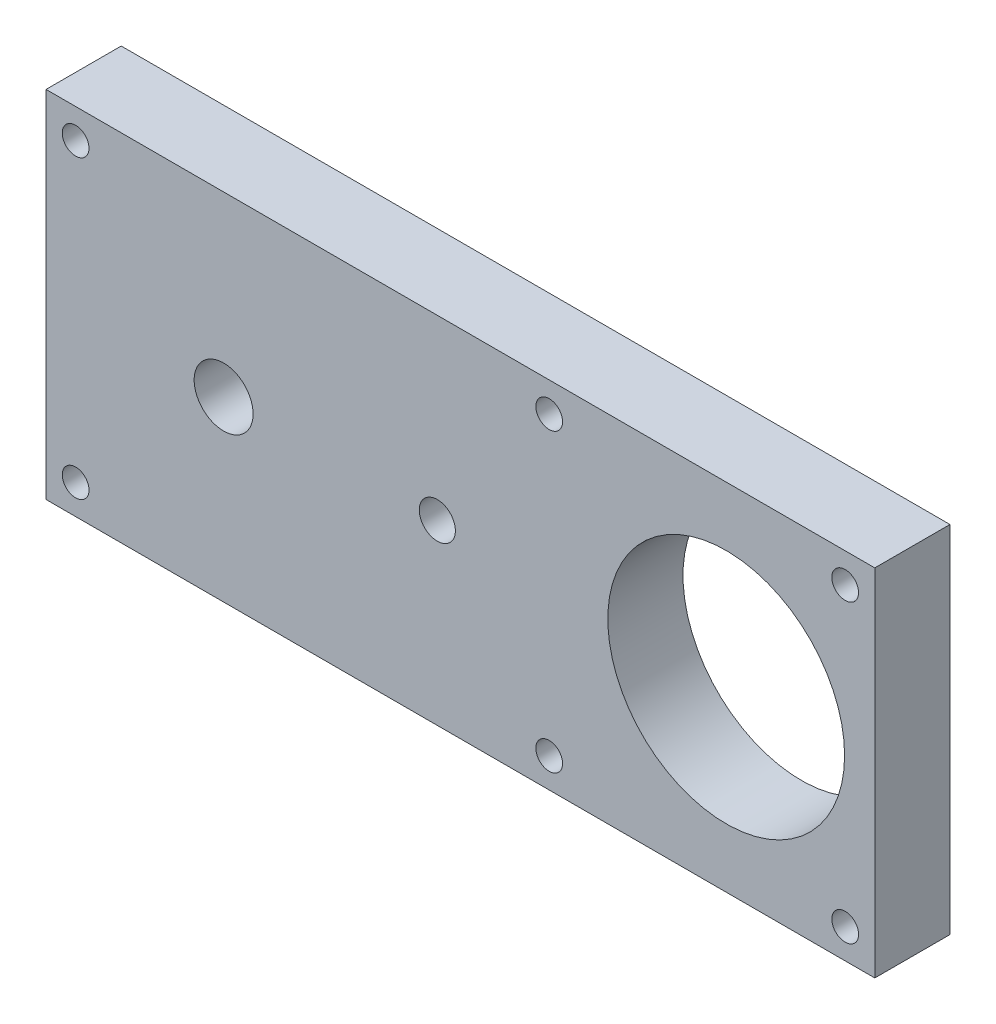
ISO-10303-21;
HEADER;
FILE_DESCRIPTION(('STEP AP214'),'2;1');
FILE_NAME('part.step','',(''),(''),'','','');
FILE_SCHEMA(('AUTOMOTIVE_DESIGN { 1 0 10303 214 1 1 1 1 }'));
ENDSEC;
DATA;
#1=APPLICATION_CONTEXT('core data for automotive mechanical design processes');
#2=APPLICATION_PROTOCOL_DEFINITION('international standard','automotive_design',2000,#1);
#3=PRODUCT_CONTEXT('',#1,'mechanical');
#4=PRODUCT('Part','Part','',(#3));
#5=PRODUCT_RELATED_PRODUCT_CATEGORY('part','',(#4));
#6=PRODUCT_DEFINITION_FORMATION('','',#4);
#7=PRODUCT_DEFINITION_CONTEXT('part definition',#1,'design');
#8=PRODUCT_DEFINITION('design','',#6,#7);
#9=PRODUCT_DEFINITION_SHAPE('','',#8);
#10=(LENGTH_UNIT() NAMED_UNIT(*) SI_UNIT(.MILLI.,.METRE.));
#11=(NAMED_UNIT(*) PLANE_ANGLE_UNIT() SI_UNIT($,.RADIAN.));
#12=(NAMED_UNIT(*) SI_UNIT($,.STERADIAN.) SOLID_ANGLE_UNIT());
#13=UNCERTAINTY_MEASURE_WITH_UNIT(LENGTH_MEASURE(1.E-05),#10,'distance_accuracy_value','');
#14=(GEOMETRIC_REPRESENTATION_CONTEXT(3) GLOBAL_UNCERTAINTY_ASSIGNED_CONTEXT((#13)) GLOBAL_UNIT_ASSIGNED_CONTEXT((#10,
#11,#12)) REPRESENTATION_CONTEXT('',''));
#15=CARTESIAN_POINT('',(0.,0.,0.));
#16=DIRECTION('',(0.,0.,1.));
#17=DIRECTION('',(1.,0.,0.));
#18=AXIS2_PLACEMENT_3D('',#15,#16,#17);
#19=CARTESIAN_POINT('',(0.,0.,0.));
#20=DIRECTION('',(0.,0.,-1.));
#21=DIRECTION('',(-1.,0.,0.));
#22=AXIS2_PLACEMENT_3D('',#19,#20,#21);
#23=PLANE('',#22);
#24=CARTESIAN_POINT('',(33.05,15.,0.));
#25=DIRECTION('',(0.,0.,1.));
#26=DIRECTION('',(1.,0.,0.));
#27=AXIS2_PLACEMENT_3D('',#24,#25,#26);
#28=CIRCLE('',#27,1.52500000000003);
#29=CARTESIAN_POINT('',(34.5750000000001,15.,0.));
#30=VERTEX_POINT('',#29);
#31=EDGE_CURVE('E157',#30,#30,#28,.T.);
#32=ORIENTED_EDGE('',*,*,#31,.T.);
#33=EDGE_LOOP('',(#32));
#34=FACE_BOUND('',#33,.T.);
#35=CARTESIAN_POINT('',(15.,15.,0.));
#36=DIRECTION('',(0.,0.,1.));
#37=DIRECTION('',(1.,0.,0.));
#38=AXIS2_PLACEMENT_3D('',#35,#36,#37);
#39=CIRCLE('',#38,2.4892);
#40=CARTESIAN_POINT('',(17.4892,15.,0.));
#41=VERTEX_POINT('',#40);
#42=EDGE_CURVE('E151',#41,#41,#39,.T.);
#43=ORIENTED_EDGE('',*,*,#42,.T.);
#44=EDGE_LOOP('',(#43));
#45=FACE_BOUND('',#44,.T.);
#46=CARTESIAN_POINT('',(57.45,15.,0.));
#47=DIRECTION('',(0.,0.,1.));
#48=DIRECTION('',(1.,0.,0.));
#49=AXIS2_PLACEMENT_3D('',#46,#47,#48);
#50=CIRCLE('',#49,10.);
#51=CARTESIAN_POINT('',(67.45,15.,0.));
#52=VERTEX_POINT('',#51);
#53=EDGE_CURVE('E147',#52,#52,#50,.T.);
#54=ORIENTED_EDGE('',*,*,#53,.T.);
#55=EDGE_LOOP('',(#54));
#56=FACE_BOUND('',#55,.T.);
#57=CARTESIAN_POINT('',(2.5,27.5,0.));
#58=DIRECTION('',(0.,0.,1.));
#59=DIRECTION('',(1.,0.,0.));
#60=AXIS2_PLACEMENT_3D('',#57,#58,#59);
#61=CIRCLE('',#60,1.1303);
#62=CARTESIAN_POINT('',(3.6303,27.5,0.));
#63=VERTEX_POINT('',#62);
#64=EDGE_CURVE('E141',#63,#63,#61,.T.);
#65=ORIENTED_EDGE('',*,*,#64,.T.);
#66=EDGE_LOOP('',(#65));
#67=FACE_BOUND('',#66,.T.);
#68=DIRECTION('',(0.,-1.,0.));
#69=VECTOR('',#68,1.);
#70=CARTESIAN_POINT('',(0.,0.,0.));
#71=LINE('',#70,#69);
#72=CARTESIAN_POINT('',(0.,30.,0.));
#73=VERTEX_POINT('',#72);
#74=CARTESIAN_POINT('',(0.,0.,0.));
#75=VERTEX_POINT('',#74);
#76=EDGE_CURVE('E98',#73,#75,#71,.T.);
#77=ORIENTED_EDGE('',*,*,#76,.F.);
#78=DIRECTION('',(-1.,0.,0.));
#79=VECTOR('',#78,1.);
#80=CARTESIAN_POINT('',(0.,30.,0.));
#81=LINE('',#80,#79);
#82=CARTESIAN_POINT('',(70.,30.,0.));
#83=VERTEX_POINT('',#82);
#84=EDGE_CURVE('E74',#83,#73,#81,.T.);
#85=ORIENTED_EDGE('',*,*,#84,.F.);
#86=DIRECTION('',(0.,1.,0.));
#87=VECTOR('',#86,1.);
#88=CARTESIAN_POINT('',(70.,0.,0.));
#89=LINE('',#88,#87);
#90=CARTESIAN_POINT('',(70.,0.,0.));
#91=VERTEX_POINT('',#90);
#92=EDGE_CURVE('E68',#91,#83,#89,.T.);
#93=ORIENTED_EDGE('',*,*,#92,.F.);
#94=DIRECTION('',(1.,0.,0.));
#95=VECTOR('',#94,1.);
#96=CARTESIAN_POINT('',(0.,0.,0.));
#97=LINE('',#96,#95);
#98=EDGE_CURVE('E90',#75,#91,#97,.T.);
#99=ORIENTED_EDGE('',*,*,#98,.F.);
#100=EDGE_LOOP('',(#77,#85,#93,#99));
#101=FACE_BOUND('',#100,.T.);
#102=CARTESIAN_POINT('',(2.5,2.5,0.));
#103=DIRECTION('',(0.,0.,1.));
#104=DIRECTION('',(1.,0.,0.));
#105=AXIS2_PLACEMENT_3D('',#102,#103,#104);
#106=CIRCLE('',#105,1.1303);
#107=CARTESIAN_POINT('',(3.6303,2.5,0.));
#108=VERTEX_POINT('',#107);
#109=EDGE_CURVE('E101',#108,#108,#106,.T.);
#110=ORIENTED_EDGE('',*,*,#109,.T.);
#111=EDGE_LOOP('',(#110));
#112=FACE_BOUND('',#111,.T.);
#113=CARTESIAN_POINT('',(42.5,2.5,0.));
#114=DIRECTION('',(0.,0.,1.));
#115=DIRECTION('',(1.,0.,0.));
#116=AXIS2_PLACEMENT_3D('',#113,#114,#115);
#117=CIRCLE('',#116,1.1303);
#118=CARTESIAN_POINT('',(43.6303,2.5,0.));
#119=VERTEX_POINT('',#118);
#120=EDGE_CURVE('E117',#119,#119,#117,.T.);
#121=ORIENTED_EDGE('',*,*,#120,.T.);
#122=EDGE_LOOP('',(#121));
#123=FACE_BOUND('',#122,.T.);
#124=CARTESIAN_POINT('',(67.5,2.5,0.));
#125=DIRECTION('',(0.,0.,1.));
#126=DIRECTION('',(1.,0.,0.));
#127=AXIS2_PLACEMENT_3D('',#124,#125,#126);
#128=CIRCLE('',#127,1.1303);
#129=CARTESIAN_POINT('',(68.6303,2.5,0.));
#130=VERTEX_POINT('',#129);
#131=EDGE_CURVE('E123',#130,#130,#128,.T.);
#132=ORIENTED_EDGE('',*,*,#131,.T.);
#133=EDGE_LOOP('',(#132));
#134=FACE_BOUND('',#133,.T.);
#135=CARTESIAN_POINT('',(67.5,27.5,0.));
#136=DIRECTION('',(0.,0.,1.));
#137=DIRECTION('',(1.,0.,0.));
#138=AXIS2_PLACEMENT_3D('',#135,#136,#137);
#139=CIRCLE('',#138,1.1303);
#140=CARTESIAN_POINT('',(68.6303,27.5,0.));
#141=VERTEX_POINT('',#140);
#142=EDGE_CURVE('E129',#141,#141,#139,.T.);
#143=ORIENTED_EDGE('',*,*,#142,.T.);
#144=EDGE_LOOP('',(#143));
#145=FACE_BOUND('',#144,.T.);
#146=CARTESIAN_POINT('',(42.5,27.5,0.));
#147=DIRECTION('',(0.,0.,1.));
#148=DIRECTION('',(1.,0.,0.));
#149=AXIS2_PLACEMENT_3D('',#146,#147,#148);
#150=CIRCLE('',#149,1.1303);
#151=CARTESIAN_POINT('',(43.6303,27.5,0.));
#152=VERTEX_POINT('',#151);
#153=EDGE_CURVE('E135',#152,#152,#150,.T.);
#154=ORIENTED_EDGE('',*,*,#153,.T.);
#155=EDGE_LOOP('',(#154));
#156=FACE_BOUND('',#155,.T.);
#157=ADVANCED_FACE('F34',(#34,#45,#56,#67,#101,#112,#123,#134,#145,#156),#23,.T.);
#158=CARTESIAN_POINT('',(0.,0.,6.35));
#159=DIRECTION('',(1.,0.,0.));
#160=DIRECTION('',(0.,0.,-1.));
#161=AXIS2_PLACEMENT_3D('',#158,#159,#160);
#162=PLANE('',#161);
#163=ORIENTED_EDGE('',*,*,#76,.T.);
#164=DIRECTION('',(0.,0.,-1.));
#165=VECTOR('',#164,1.);
#166=CARTESIAN_POINT('',(0.,0.,6.35));
#167=LINE('',#166,#165);
#168=CARTESIAN_POINT('',(0.,0.,6.35));
#169=VERTEX_POINT('',#168);
#170=EDGE_CURVE('E11',#169,#75,#167,.T.);
#171=ORIENTED_EDGE('',*,*,#170,.F.);
#172=DIRECTION('',(0.,-1.,0.));
#173=VECTOR('',#172,1.);
#174=CARTESIAN_POINT('',(0.,0.,6.35));
#175=LINE('',#174,#173);
#176=CARTESIAN_POINT('',(0.,30.,6.35));
#177=VERTEX_POINT('',#176);
#178=EDGE_CURVE('E86',#177,#169,#175,.T.);
#179=ORIENTED_EDGE('',*,*,#178,.F.);
#180=DIRECTION('',(0.,0.,-1.));
#181=VECTOR('',#180,1.);
#182=CARTESIAN_POINT('',(0.,30.,6.35));
#183=LINE('',#182,#181);
#184=EDGE_CURVE('E94',#177,#73,#183,.T.);
#185=ORIENTED_EDGE('',*,*,#184,.T.);
#186=EDGE_LOOP('',(#163,#171,#179,#185));
#187=FACE_BOUND('',#186,.T.);
#188=ADVANCED_FACE('F36',(#187),#162,.F.);
#189=CARTESIAN_POINT('',(0.,0.,6.35));
#190=DIRECTION('',(0.,1.,0.));
#191=DIRECTION('',(0.,0.,1.));
#192=AXIS2_PLACEMENT_3D('',#189,#190,#191);
#193=PLANE('',#192);
#194=ORIENTED_EDGE('',*,*,#98,.T.);
#195=DIRECTION('',(0.,0.,-1.));
#196=VECTOR('',#195,1.);
#197=CARTESIAN_POINT('',(70.,0.,6.35));
#198=LINE('',#197,#196);
#199=CARTESIAN_POINT('',(70.,0.,6.35));
#200=VERTEX_POINT('',#199);
#201=EDGE_CURVE('E43',#200,#91,#198,.T.);
#202=ORIENTED_EDGE('',*,*,#201,.F.);
#203=DIRECTION('',(1.,0.,0.));
#204=VECTOR('',#203,1.);
#205=CARTESIAN_POINT('',(0.,0.,6.35));
#206=LINE('',#205,#204);
#207=EDGE_CURVE('E81',#169,#200,#206,.T.);
#208=ORIENTED_EDGE('',*,*,#207,.F.);
#209=ORIENTED_EDGE('',*,*,#170,.T.);
#210=EDGE_LOOP('',(#194,#202,#208,#209));
#211=FACE_BOUND('',#210,.T.);
#212=ADVANCED_FACE('F89',(#211),#193,.F.);
#213=CARTESIAN_POINT('',(70.,0.,6.35));
#214=DIRECTION('',(-1.,0.,0.));
#215=DIRECTION('',(0.,0.,1.));
#216=AXIS2_PLACEMENT_3D('',#213,#214,#215);
#217=PLANE('',#216);
#218=ORIENTED_EDGE('',*,*,#92,.T.);
#219=DIRECTION('',(0.,0.,-1.));
#220=VECTOR('',#219,1.);
#221=CARTESIAN_POINT('',(70.,30.,6.35));
#222=LINE('',#221,#220);
#223=CARTESIAN_POINT('',(70.,30.,6.35));
#224=VERTEX_POINT('',#223);
#225=EDGE_CURVE('E91',#224,#83,#222,.T.);
#226=ORIENTED_EDGE('',*,*,#225,.F.);
#227=DIRECTION('',(0.,1.,0.));
#228=VECTOR('',#227,1.);
#229=CARTESIAN_POINT('',(70.,0.,6.35));
#230=LINE('',#229,#228);
#231=EDGE_CURVE('E84',#200,#224,#230,.T.);
#232=ORIENTED_EDGE('',*,*,#231,.F.);
#233=ORIENTED_EDGE('',*,*,#201,.T.);
#234=EDGE_LOOP('',(#218,#226,#232,#233));
#235=FACE_BOUND('',#234,.T.);
#236=ADVANCED_FACE('F92',(#235),#217,.F.);
#237=CARTESIAN_POINT('',(0.,30.,6.35));
#238=DIRECTION('',(0.,-1.,0.));
#239=DIRECTION('',(0.,0.,-1.));
#240=AXIS2_PLACEMENT_3D('',#237,#238,#239);
#241=PLANE('',#240);
#242=ORIENTED_EDGE('',*,*,#84,.T.);
#243=ORIENTED_EDGE('',*,*,#184,.F.);
#244=DIRECTION('',(-1.,0.,0.));
#245=VECTOR('',#244,1.);
#246=CARTESIAN_POINT('',(0.,30.,6.35));
#247=LINE('',#246,#245);
#248=EDGE_CURVE('E51',#224,#177,#247,.T.);
#249=ORIENTED_EDGE('',*,*,#248,.F.);
#250=ORIENTED_EDGE('',*,*,#225,.T.);
#251=EDGE_LOOP('',(#242,#243,#249,#250));
#252=FACE_BOUND('',#251,.T.);
#253=ADVANCED_FACE('F106',(#252),#241,.F.);
#254=CARTESIAN_POINT('',(0.,0.,6.35));
#255=DIRECTION('',(0.,0.,-1.));
#256=DIRECTION('',(-1.,0.,0.));
#257=AXIS2_PLACEMENT_3D('',#254,#255,#256);
#258=PLANE('',#257);
#259=CARTESIAN_POINT('',(33.05,15.,6.35));
#260=DIRECTION('',(0.,0.,1.));
#261=DIRECTION('',(1.,0.,0.));
#262=AXIS2_PLACEMENT_3D('',#259,#260,#261);
#263=CIRCLE('',#262,1.52500000000003);
#264=CARTESIAN_POINT('',(34.5750000000001,15.,6.35));
#265=VERTEX_POINT('',#264);
#266=EDGE_CURVE('E160',#265,#265,#263,.T.);
#267=ORIENTED_EDGE('',*,*,#266,.F.);
#268=EDGE_LOOP('',(#267));
#269=FACE_BOUND('',#268,.T.);
#270=CARTESIAN_POINT('',(15.,15.,6.35));
#271=DIRECTION('',(0.,0.,1.));
#272=DIRECTION('',(1.,0.,0.));
#273=AXIS2_PLACEMENT_3D('',#270,#271,#272);
#274=CIRCLE('',#273,2.4892);
#275=CARTESIAN_POINT('',(17.4892,15.,6.35));
#276=VERTEX_POINT('',#275);
#277=EDGE_CURVE('E154',#276,#276,#274,.T.);
#278=ORIENTED_EDGE('',*,*,#277,.F.);
#279=EDGE_LOOP('',(#278));
#280=FACE_BOUND('',#279,.T.);
#281=CARTESIAN_POINT('',(57.45,15.,6.35));
#282=DIRECTION('',(0.,0.,1.));
#283=DIRECTION('',(1.,0.,0.));
#284=AXIS2_PLACEMENT_3D('',#281,#282,#283);
#285=CIRCLE('',#284,10.);
#286=CARTESIAN_POINT('',(67.45,15.,6.35));
#287=VERTEX_POINT('',#286);
#288=EDGE_CURVE('E148',#287,#287,#285,.T.);
#289=ORIENTED_EDGE('',*,*,#288,.F.);
#290=EDGE_LOOP('',(#289));
#291=FACE_BOUND('',#290,.T.);
#292=CARTESIAN_POINT('',(2.5,27.5,6.35));
#293=DIRECTION('',(0.,0.,1.));
#294=DIRECTION('',(1.,0.,0.));
#295=AXIS2_PLACEMENT_3D('',#292,#293,#294);
#296=CIRCLE('',#295,1.13029999999999);
#297=CARTESIAN_POINT('',(3.63029999999999,27.5,6.35));
#298=VERTEX_POINT('',#297);
#299=EDGE_CURVE('E144',#298,#298,#296,.T.);
#300=ORIENTED_EDGE('',*,*,#299,.F.);
#301=EDGE_LOOP('',(#300));
#302=FACE_BOUND('',#301,.T.);
#303=CARTESIAN_POINT('',(42.5,27.5,6.35));
#304=DIRECTION('',(0.,0.,1.));
#305=DIRECTION('',(1.,0.,0.));
#306=AXIS2_PLACEMENT_3D('',#303,#304,#305);
#307=CIRCLE('',#306,1.13029999999999);
#308=CARTESIAN_POINT('',(43.6303,27.5,6.35));
#309=VERTEX_POINT('',#308);
#310=EDGE_CURVE('E138',#309,#309,#307,.T.);
#311=ORIENTED_EDGE('',*,*,#310,.F.);
#312=EDGE_LOOP('',(#311));
#313=FACE_BOUND('',#312,.T.);
#314=CARTESIAN_POINT('',(67.5,27.5,6.35));
#315=DIRECTION('',(0.,0.,1.));
#316=DIRECTION('',(1.,0.,0.));
#317=AXIS2_PLACEMENT_3D('',#314,#315,#316);
#318=CIRCLE('',#317,1.13029999999999);
#319=CARTESIAN_POINT('',(68.6303,27.5,6.35));
#320=VERTEX_POINT('',#319);
#321=EDGE_CURVE('E132',#320,#320,#318,.T.);
#322=ORIENTED_EDGE('',*,*,#321,.F.);
#323=EDGE_LOOP('',(#322));
#324=FACE_BOUND('',#323,.T.);
#325=CARTESIAN_POINT('',(67.5,2.5,6.35));
#326=DIRECTION('',(0.,0.,1.));
#327=DIRECTION('',(1.,0.,0.));
#328=AXIS2_PLACEMENT_3D('',#325,#326,#327);
#329=CIRCLE('',#328,1.13029999999999);
#330=CARTESIAN_POINT('',(68.6303,2.5,6.35));
#331=VERTEX_POINT('',#330);
#332=EDGE_CURVE('E126',#331,#331,#329,.T.);
#333=ORIENTED_EDGE('',*,*,#332,.F.);
#334=EDGE_LOOP('',(#333));
#335=FACE_BOUND('',#334,.T.);
#336=CARTESIAN_POINT('',(42.5,2.5,6.35));
#337=DIRECTION('',(0.,0.,1.));
#338=DIRECTION('',(1.,0.,0.));
#339=AXIS2_PLACEMENT_3D('',#336,#337,#338);
#340=CIRCLE('',#339,1.13029999999999);
#341=CARTESIAN_POINT('',(43.6303,2.5,6.35));
#342=VERTEX_POINT('',#341);
#343=EDGE_CURVE('E120',#342,#342,#340,.T.);
#344=ORIENTED_EDGE('',*,*,#343,.F.);
#345=EDGE_LOOP('',(#344));
#346=FACE_BOUND('',#345,.T.);
#347=CARTESIAN_POINT('',(2.5,2.5,6.35));
#348=DIRECTION('',(0.,0.,1.));
#349=DIRECTION('',(1.,0.,0.));
#350=AXIS2_PLACEMENT_3D('',#347,#348,#349);
#351=CIRCLE('',#350,1.13029999999999);
#352=CARTESIAN_POINT('',(3.63029999999999,2.5,6.35));
#353=VERTEX_POINT('',#352);
#354=EDGE_CURVE('E114',#353,#353,#351,.T.);
#355=ORIENTED_EDGE('',*,*,#354,.F.);
#356=EDGE_LOOP('',(#355));
#357=FACE_BOUND('',#356,.T.);
#358=ORIENTED_EDGE('',*,*,#178,.T.);
#359=ORIENTED_EDGE('',*,*,#207,.T.);
#360=ORIENTED_EDGE('',*,*,#231,.T.);
#361=ORIENTED_EDGE('',*,*,#248,.T.);
#362=EDGE_LOOP('',(#358,#359,#360,#361));
#363=FACE_BOUND('',#362,.T.);
#364=ADVANCED_FACE('F82',(#269,#280,#291,#302,#313,#324,#335,#346,#357,#363),#258,.F.);
#365=CARTESIAN_POINT('',(2.5,2.5,6.35));
#366=DIRECTION('',(0.,0.,1.));
#367=DIRECTION('',(1.,0.,0.));
#368=AXIS2_PLACEMENT_3D('',#365,#366,#367);
#369=CYLINDRICAL_SURFACE('',#368,1.13029999999999);
#370=ORIENTED_EDGE('',*,*,#109,.F.);
#371=EDGE_LOOP('',(#370));
#372=FACE_BOUND('',#371,.T.);
#373=ORIENTED_EDGE('',*,*,#354,.T.);
#374=EDGE_LOOP('',(#373));
#375=FACE_BOUND('',#374,.T.);
#376=ADVANCED_FACE('F177',(#372,#375),#369,.F.);
#377=CARTESIAN_POINT('',(42.5,2.5,6.35));
#378=DIRECTION('',(0.,0.,1.));
#379=DIRECTION('',(1.,0.,0.));
#380=AXIS2_PLACEMENT_3D('',#377,#378,#379);
#381=CYLINDRICAL_SURFACE('',#380,1.13029999999999);
#382=ORIENTED_EDGE('',*,*,#120,.F.);
#383=EDGE_LOOP('',(#382));
#384=FACE_BOUND('',#383,.T.);
#385=ORIENTED_EDGE('',*,*,#343,.T.);
#386=EDGE_LOOP('',(#385));
#387=FACE_BOUND('',#386,.T.);
#388=ADVANCED_FACE('F196',(#384,#387),#381,.F.);
#389=CARTESIAN_POINT('',(67.5,2.5,6.35));
#390=DIRECTION('',(0.,0.,1.));
#391=DIRECTION('',(1.,0.,0.));
#392=AXIS2_PLACEMENT_3D('',#389,#390,#391);
#393=CYLINDRICAL_SURFACE('',#392,1.13029999999999);
#394=ORIENTED_EDGE('',*,*,#131,.F.);
#395=EDGE_LOOP('',(#394));
#396=FACE_BOUND('',#395,.T.);
#397=ORIENTED_EDGE('',*,*,#332,.T.);
#398=EDGE_LOOP('',(#397));
#399=FACE_BOUND('',#398,.T.);
#400=ADVANCED_FACE('F203',(#396,#399),#393,.F.);
#401=CARTESIAN_POINT('',(67.5,27.5,6.35));
#402=DIRECTION('',(0.,0.,1.));
#403=DIRECTION('',(1.,0.,0.));
#404=AXIS2_PLACEMENT_3D('',#401,#402,#403);
#405=CYLINDRICAL_SURFACE('',#404,1.13029999999999);
#406=ORIENTED_EDGE('',*,*,#142,.F.);
#407=EDGE_LOOP('',(#406));
#408=FACE_BOUND('',#407,.T.);
#409=ORIENTED_EDGE('',*,*,#321,.T.);
#410=EDGE_LOOP('',(#409));
#411=FACE_BOUND('',#410,.T.);
#412=ADVANCED_FACE('F257',(#408,#411),#405,.F.);
#413=CARTESIAN_POINT('',(42.5,27.5,6.35));
#414=DIRECTION('',(0.,0.,1.));
#415=DIRECTION('',(1.,0.,0.));
#416=AXIS2_PLACEMENT_3D('',#413,#414,#415);
#417=CYLINDRICAL_SURFACE('',#416,1.13029999999999);
#418=ORIENTED_EDGE('',*,*,#153,.F.);
#419=EDGE_LOOP('',(#418));
#420=FACE_BOUND('',#419,.T.);
#421=ORIENTED_EDGE('',*,*,#310,.T.);
#422=EDGE_LOOP('',(#421));
#423=FACE_BOUND('',#422,.T.);
#424=ADVANCED_FACE('F266',(#420,#423),#417,.F.);
#425=CARTESIAN_POINT('',(2.5,27.5,6.35));
#426=DIRECTION('',(0.,0.,1.));
#427=DIRECTION('',(1.,0.,0.));
#428=AXIS2_PLACEMENT_3D('',#425,#426,#427);
#429=CYLINDRICAL_SURFACE('',#428,1.13029999999999);
#430=ORIENTED_EDGE('',*,*,#64,.F.);
#431=EDGE_LOOP('',(#430));
#432=FACE_BOUND('',#431,.T.);
#433=ORIENTED_EDGE('',*,*,#299,.T.);
#434=EDGE_LOOP('',(#433));
#435=FACE_BOUND('',#434,.T.);
#436=ADVANCED_FACE('F275',(#432,#435),#429,.F.);
#437=CARTESIAN_POINT('',(57.45,15.,0.));
#438=DIRECTION('',(0.,0.,1.));
#439=DIRECTION('',(1.,0.,0.));
#440=AXIS2_PLACEMENT_3D('',#437,#438,#439);
#441=CYLINDRICAL_SURFACE('',#440,10.);
#442=ORIENTED_EDGE('',*,*,#53,.F.);
#443=EDGE_LOOP('',(#442));
#444=FACE_BOUND('',#443,.T.);
#445=ORIENTED_EDGE('',*,*,#288,.T.);
#446=EDGE_LOOP('',(#445));
#447=FACE_BOUND('',#446,.T.);
#448=ADVANCED_FACE('F283',(#444,#447),#441,.F.);
#449=CARTESIAN_POINT('',(15.,15.,0.));
#450=DIRECTION('',(0.,0.,1.));
#451=DIRECTION('',(1.,0.,0.));
#452=AXIS2_PLACEMENT_3D('',#449,#450,#451);
#453=CYLINDRICAL_SURFACE('',#452,2.4892);
#454=ORIENTED_EDGE('',*,*,#42,.F.);
#455=EDGE_LOOP('',(#454));
#456=FACE_BOUND('',#455,.T.);
#457=ORIENTED_EDGE('',*,*,#277,.T.);
#458=EDGE_LOOP('',(#457));
#459=FACE_BOUND('',#458,.T.);
#460=ADVANCED_FACE('F171',(#456,#459),#453,.F.);
#461=CARTESIAN_POINT('',(33.05,15.,0.));
#462=DIRECTION('',(0.,0.,1.));
#463=DIRECTION('',(1.,0.,0.));
#464=AXIS2_PLACEMENT_3D('',#461,#462,#463);
#465=CYLINDRICAL_SURFACE('',#464,1.52500000000003);
#466=ORIENTED_EDGE('',*,*,#31,.F.);
#467=EDGE_LOOP('',(#466));
#468=FACE_BOUND('',#467,.T.);
#469=ORIENTED_EDGE('',*,*,#266,.T.);
#470=EDGE_LOOP('',(#469));
#471=FACE_BOUND('',#470,.T.);
#472=ADVANCED_FACE('F168',(#468,#471),#465,.F.);
#473=CLOSED_SHELL('',(#157,#188,#212,#236,#253,#364,#376,#388,#400,#412,#424,#436,#448,#460,#472));
#474=MANIFOLD_SOLID_BREP('B2',#473);
#475=ADVANCED_BREP_SHAPE_REPRESENTATION('',(#18,#474),#14);
#476=SHAPE_DEFINITION_REPRESENTATION(#9,#475);
ENDSEC;
END-ISO-10303-21;
